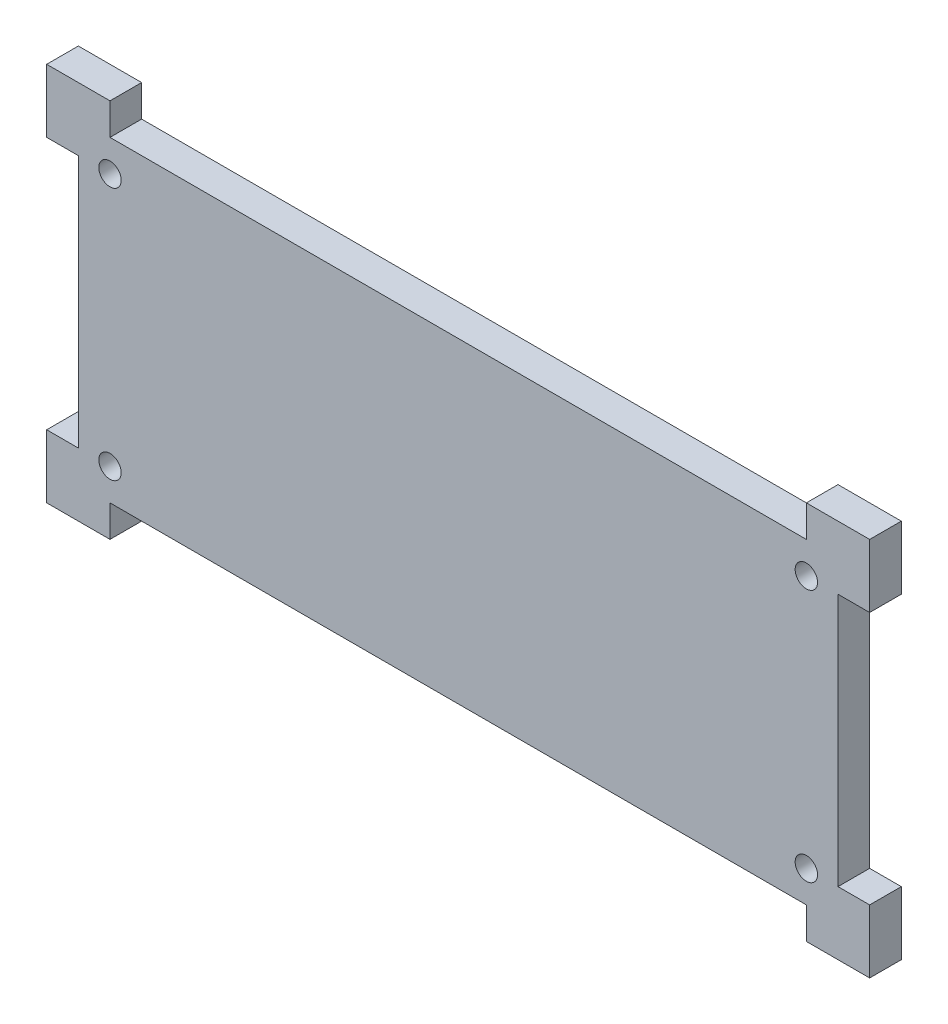
ISO-10303-21;
HEADER;
FILE_DESCRIPTION(('STEP AP214'),'2;1');
FILE_NAME('part.step','',(''),(''),'','','');
FILE_SCHEMA(('AUTOMOTIVE_DESIGN { 1 0 10303 214 1 1 1 1 }'));
ENDSEC;
DATA;
#1=APPLICATION_CONTEXT('core data for automotive mechanical design processes');
#2=APPLICATION_PROTOCOL_DEFINITION('international standard','automotive_design',2000,#1);
#3=PRODUCT_CONTEXT('',#1,'mechanical');
#4=PRODUCT('Part','Part','',(#3));
#5=PRODUCT_RELATED_PRODUCT_CATEGORY('part','',(#4));
#6=PRODUCT_DEFINITION_FORMATION('','',#4);
#7=PRODUCT_DEFINITION_CONTEXT('part definition',#1,'design');
#8=PRODUCT_DEFINITION('design','',#6,#7);
#9=PRODUCT_DEFINITION_SHAPE('','',#8);
#10=(LENGTH_UNIT() NAMED_UNIT(*) SI_UNIT(.MILLI.,.METRE.));
#11=(NAMED_UNIT(*) PLANE_ANGLE_UNIT() SI_UNIT($,.RADIAN.));
#12=(NAMED_UNIT(*) SI_UNIT($,.STERADIAN.) SOLID_ANGLE_UNIT());
#13=UNCERTAINTY_MEASURE_WITH_UNIT(LENGTH_MEASURE(1.E-05),#10,'distance_accuracy_value','');
#14=(GEOMETRIC_REPRESENTATION_CONTEXT(3) GLOBAL_UNCERTAINTY_ASSIGNED_CONTEXT((#13)) GLOBAL_UNIT_ASSIGNED_CONTEXT((#10,
#11,#12)) REPRESENTATION_CONTEXT('',''));
#15=CARTESIAN_POINT('',(0.,0.,0.));
#16=DIRECTION('',(0.,0.,1.));
#17=DIRECTION('',(1.,0.,0.));
#18=AXIS2_PLACEMENT_3D('',#15,#16,#17);
#19=CARTESIAN_POINT('',(-95.2499999999999,-6.34999999999999,188.18632750361));
#20=DIRECTION('',(0.,1.,0.));
#21=DIRECTION('',(0.,0.,1.));
#22=AXIS2_PLACEMENT_3D('',#19,#20,#21);
#23=PLANE('',#22);
#24=DIRECTION('',(1.,0.,0.));
#25=VECTOR('',#24,1.);
#26=CARTESIAN_POINT('',(-95.2499999999999,-6.34999999999999,6.34999999999999));
#27=LINE('',#26,#25);
#28=CARTESIAN_POINT('',(-107.95,-6.34999999999999,6.34999999999999));
#29=VERTEX_POINT('',#28);
#30=CARTESIAN_POINT('',(-95.2499999999999,-6.34999999999999,6.34999999999999));
#31=VERTEX_POINT('',#30);
#32=EDGE_CURVE('E242',#29,#31,#27,.T.);
#33=ORIENTED_EDGE('',*,*,#32,.F.);
#34=DIRECTION('',(0.,0.,-1.));
#35=VECTOR('',#34,1.);
#36=CARTESIAN_POINT('',(-107.95,-6.34999999999999,188.18632750361));
#37=LINE('',#36,#35);
#38=CARTESIAN_POINT('',(-107.95,-6.34999999999999,0.));
#39=VERTEX_POINT('',#38);
#40=EDGE_CURVE('E39',#29,#39,#37,.T.);
#41=ORIENTED_EDGE('',*,*,#40,.T.);
#42=DIRECTION('',(1.,0.,0.));
#43=VECTOR('',#42,1.);
#44=CARTESIAN_POINT('',(-95.2499999999999,-6.34999999999999,0.));
#45=LINE('',#44,#43);
#46=CARTESIAN_POINT('',(-95.2499999999999,-6.34999999999999,0.));
#47=VERTEX_POINT('',#46);
#48=EDGE_CURVE('E250',#39,#47,#45,.T.);
#49=ORIENTED_EDGE('',*,*,#48,.T.);
#50=DIRECTION('',(0.,0.,-1.));
#51=VECTOR('',#50,1.);
#52=CARTESIAN_POINT('',(-95.2499999999999,-6.34999999999999,188.18632750361));
#53=LINE('',#52,#51);
#54=EDGE_CURVE('E138',#31,#47,#53,.T.);
#55=ORIENTED_EDGE('',*,*,#54,.F.);
#56=EDGE_LOOP('',(#33,#41,#49,#55));
#57=FACE_BOUND('',#56,.T.);
#58=ADVANCED_FACE('F35',(#57),#23,.F.);
#59=CARTESIAN_POINT('',(-95.2499999999999,0.,188.18632750361));
#60=DIRECTION('',(-1.,0.,0.));
#61=DIRECTION('',(0.,0.,1.));
#62=AXIS2_PLACEMENT_3D('',#59,#60,#61);
#63=PLANE('',#62);
#64=DIRECTION('',(0.,1.,0.));
#65=VECTOR('',#64,1.);
#66=CARTESIAN_POINT('',(-95.2499999999999,0.,6.34999999999999));
#67=LINE('',#66,#65);
#68=CARTESIAN_POINT('',(-95.2499999999999,0.,6.34999999999999));
#69=VERTEX_POINT('',#68);
#70=EDGE_CURVE('E145',#31,#69,#67,.T.);
#71=ORIENTED_EDGE('',*,*,#70,.F.);
#72=ORIENTED_EDGE('',*,*,#54,.T.);
#73=DIRECTION('',(0.,1.,0.));
#74=VECTOR('',#73,1.);
#75=CARTESIAN_POINT('',(-95.2499999999999,0.,0.));
#76=LINE('',#75,#74);
#77=CARTESIAN_POINT('',(-95.2499999999999,0.,0.));
#78=VERTEX_POINT('',#77);
#79=EDGE_CURVE('E249',#47,#78,#76,.T.);
#80=ORIENTED_EDGE('',*,*,#79,.T.);
#81=DIRECTION('',(0.,0.,-1.));
#82=VECTOR('',#81,1.);
#83=CARTESIAN_POINT('',(-95.2499999999999,0.,188.18632750361));
#84=LINE('',#83,#82);
#85=EDGE_CURVE('E251',#69,#78,#84,.T.);
#86=ORIENTED_EDGE('',*,*,#85,.F.);
#87=EDGE_LOOP('',(#71,#72,#80,#86));
#88=FACE_BOUND('',#87,.T.);
#89=ADVANCED_FACE('F394',(#88),#63,.F.);
#90=CARTESIAN_POINT('',(44.45,0.,188.18632750361));
#91=DIRECTION('',(0.,1.,0.));
#92=DIRECTION('',(0.,0.,1.));
#93=AXIS2_PLACEMENT_3D('',#90,#91,#92);
#94=PLANE('',#93);
#95=DIRECTION('',(1.,0.,0.));
#96=VECTOR('',#95,1.);
#97=CARTESIAN_POINT('',(44.45,0.,6.34999999999999));
#98=LINE('',#97,#96);
#99=CARTESIAN_POINT('',(44.45,0.,6.34999999999999));
#100=VERTEX_POINT('',#99);
#101=EDGE_CURVE('E238',#69,#100,#98,.T.);
#102=ORIENTED_EDGE('',*,*,#101,.F.);
#103=ORIENTED_EDGE('',*,*,#85,.T.);
#104=DIRECTION('',(1.,0.,0.));
#105=VECTOR('',#104,1.);
#106=CARTESIAN_POINT('',(44.45,0.,0.));
#107=LINE('',#106,#105);
#108=CARTESIAN_POINT('',(44.45,0.,0.));
#109=VERTEX_POINT('',#108);
#110=EDGE_CURVE('E253',#78,#109,#107,.T.);
#111=ORIENTED_EDGE('',*,*,#110,.T.);
#112=DIRECTION('',(0.,0.,-1.));
#113=VECTOR('',#112,1.);
#114=CARTESIAN_POINT('',(44.45,0.,188.18632750361));
#115=LINE('',#114,#113);
#116=EDGE_CURVE('E254',#100,#109,#115,.T.);
#117=ORIENTED_EDGE('',*,*,#116,.F.);
#118=EDGE_LOOP('',(#102,#103,#111,#117));
#119=FACE_BOUND('',#118,.T.);
#120=ADVANCED_FACE('F398',(#119),#94,.F.);
#121=CARTESIAN_POINT('',(44.45,-6.34999999999999,188.18632750361));
#122=DIRECTION('',(1.,0.,0.));
#123=DIRECTION('',(0.,0.,-1.));
#124=AXIS2_PLACEMENT_3D('',#121,#122,#123);
#125=PLANE('',#124);
#126=DIRECTION('',(0.,-1.,0.));
#127=VECTOR('',#126,1.);
#128=CARTESIAN_POINT('',(44.45,-6.34999999999999,6.34999999999999));
#129=LINE('',#128,#127);
#130=CARTESIAN_POINT('',(44.45,-6.34999999999999,6.34999999999999));
#131=VERTEX_POINT('',#130);
#132=EDGE_CURVE('E235',#100,#131,#129,.T.);
#133=ORIENTED_EDGE('',*,*,#132,.F.);
#134=ORIENTED_EDGE('',*,*,#116,.T.);
#135=DIRECTION('',(0.,-1.,0.));
#136=VECTOR('',#135,1.);
#137=CARTESIAN_POINT('',(44.45,-6.34999999999999,0.));
#138=LINE('',#137,#136);
#139=CARTESIAN_POINT('',(44.45,-6.34999999999999,0.));
#140=VERTEX_POINT('',#139);
#141=EDGE_CURVE('E256',#109,#140,#138,.T.);
#142=ORIENTED_EDGE('',*,*,#141,.T.);
#143=DIRECTION('',(0.,0.,-1.));
#144=VECTOR('',#143,1.);
#145=CARTESIAN_POINT('',(44.45,-6.34999999999999,188.18632750361));
#146=LINE('',#145,#144);
#147=EDGE_CURVE('E257',#131,#140,#146,.T.);
#148=ORIENTED_EDGE('',*,*,#147,.F.);
#149=EDGE_LOOP('',(#133,#134,#142,#148));
#150=FACE_BOUND('',#149,.T.);
#151=ADVANCED_FACE('F403',(#150),#125,.F.);
#152=CARTESIAN_POINT('',(57.15,-6.34999999999999,188.18632750361));
#153=DIRECTION('',(0.,1.,0.));
#154=DIRECTION('',(0.,0.,1.));
#155=AXIS2_PLACEMENT_3D('',#152,#153,#154);
#156=PLANE('',#155);
#157=DIRECTION('',(1.,0.,0.));
#158=VECTOR('',#157,1.);
#159=CARTESIAN_POINT('',(57.15,-6.34999999999999,6.34999999999999));
#160=LINE('',#159,#158);
#161=CARTESIAN_POINT('',(57.15,-6.34999999999999,6.34999999999999));
#162=VERTEX_POINT('',#161);
#163=EDGE_CURVE('E232',#131,#162,#160,.T.);
#164=ORIENTED_EDGE('',*,*,#163,.F.);
#165=ORIENTED_EDGE('',*,*,#147,.T.);
#166=DIRECTION('',(1.,0.,0.));
#167=VECTOR('',#166,1.);
#168=CARTESIAN_POINT('',(57.15,-6.34999999999999,0.));
#169=LINE('',#168,#167);
#170=CARTESIAN_POINT('',(57.15,-6.34999999999999,0.));
#171=VERTEX_POINT('',#170);
#172=EDGE_CURVE('E259',#140,#171,#169,.T.);
#173=ORIENTED_EDGE('',*,*,#172,.T.);
#174=DIRECTION('',(0.,0.,-1.));
#175=VECTOR('',#174,1.);
#176=CARTESIAN_POINT('',(57.15,-6.34999999999999,188.18632750361));
#177=LINE('',#176,#175);
#178=EDGE_CURVE('E260',#162,#171,#177,.T.);
#179=ORIENTED_EDGE('',*,*,#178,.F.);
#180=EDGE_LOOP('',(#164,#165,#173,#179));
#181=FACE_BOUND('',#180,.T.);
#182=ADVANCED_FACE('F407',(#181),#156,.F.);
#183=CARTESIAN_POINT('',(57.15,6.35,188.18632750361));
#184=DIRECTION('',(-1.,0.,0.));
#185=DIRECTION('',(0.,-1.,0.));
#186=AXIS2_PLACEMENT_3D('',#183,#184,#185);
#187=PLANE('',#186);
#188=DIRECTION('',(0.,1.,0.));
#189=VECTOR('',#188,1.);
#190=CARTESIAN_POINT('',(57.15,6.35,6.34999999999999));
#191=LINE('',#190,#189);
#192=CARTESIAN_POINT('',(57.15,6.35,6.34999999999999));
#193=VERTEX_POINT('',#192);
#194=EDGE_CURVE('E229',#162,#193,#191,.T.);
#195=ORIENTED_EDGE('',*,*,#194,.F.);
#196=ORIENTED_EDGE('',*,*,#178,.T.);
#197=DIRECTION('',(0.,1.,0.));
#198=VECTOR('',#197,1.);
#199=CARTESIAN_POINT('',(57.15,6.35,0.));
#200=LINE('',#199,#198);
#201=CARTESIAN_POINT('',(57.15,6.35,0.));
#202=VERTEX_POINT('',#201);
#203=EDGE_CURVE('E262',#171,#202,#200,.T.);
#204=ORIENTED_EDGE('',*,*,#203,.T.);
#205=DIRECTION('',(0.,0.,-1.));
#206=VECTOR('',#205,1.);
#207=CARTESIAN_POINT('',(57.15,6.35,188.18632750361));
#208=LINE('',#207,#206);
#209=EDGE_CURVE('E263',#193,#202,#208,.T.);
#210=ORIENTED_EDGE('',*,*,#209,.F.);
#211=EDGE_LOOP('',(#195,#196,#204,#210));
#212=FACE_BOUND('',#211,.T.);
#213=ADVANCED_FACE('F411',(#212),#187,.F.);
#214=CARTESIAN_POINT('',(50.8,6.35,188.18632750361));
#215=DIRECTION('',(0.,-1.,0.));
#216=DIRECTION('',(0.,0.,-1.));
#217=AXIS2_PLACEMENT_3D('',#214,#215,#216);
#218=PLANE('',#217);
#219=DIRECTION('',(-1.,0.,0.));
#220=VECTOR('',#219,1.);
#221=CARTESIAN_POINT('',(50.8,6.35,6.34999999999999));
#222=LINE('',#221,#220);
#223=CARTESIAN_POINT('',(50.8,6.35,6.34999999999999));
#224=VERTEX_POINT('',#223);
#225=EDGE_CURVE('E226',#193,#224,#222,.T.);
#226=ORIENTED_EDGE('',*,*,#225,.F.);
#227=ORIENTED_EDGE('',*,*,#209,.T.);
#228=DIRECTION('',(-1.,0.,0.));
#229=VECTOR('',#228,1.);
#230=CARTESIAN_POINT('',(50.8,6.35,0.));
#231=LINE('',#230,#229);
#232=CARTESIAN_POINT('',(50.8,6.35,0.));
#233=VERTEX_POINT('',#232);
#234=EDGE_CURVE('E265',#202,#233,#231,.T.);
#235=ORIENTED_EDGE('',*,*,#234,.T.);
#236=DIRECTION('',(0.,0.,-1.));
#237=VECTOR('',#236,1.);
#238=CARTESIAN_POINT('',(50.8,6.35,188.18632750361));
#239=LINE('',#238,#237);
#240=EDGE_CURVE('E266',#224,#233,#239,.T.);
#241=ORIENTED_EDGE('',*,*,#240,.F.);
#242=EDGE_LOOP('',(#226,#227,#235,#241));
#243=FACE_BOUND('',#242,.T.);
#244=ADVANCED_FACE('F415',(#243),#218,.F.);
#245=CARTESIAN_POINT('',(50.8,57.15,188.18632750361));
#246=DIRECTION('',(-1.,0.,0.));
#247=DIRECTION('',(0.,0.,1.));
#248=AXIS2_PLACEMENT_3D('',#245,#246,#247);
#249=PLANE('',#248);
#250=DIRECTION('',(0.,1.,0.));
#251=VECTOR('',#250,1.);
#252=CARTESIAN_POINT('',(50.8,57.15,6.34999999999999));
#253=LINE('',#252,#251);
#254=CARTESIAN_POINT('',(50.8,57.15,6.34999999999999));
#255=VERTEX_POINT('',#254);
#256=EDGE_CURVE('E223',#224,#255,#253,.T.);
#257=ORIENTED_EDGE('',*,*,#256,.F.);
#258=ORIENTED_EDGE('',*,*,#240,.T.);
#259=DIRECTION('',(0.,1.,0.));
#260=VECTOR('',#259,1.);
#261=CARTESIAN_POINT('',(50.8,57.15,0.));
#262=LINE('',#261,#260);
#263=CARTESIAN_POINT('',(50.8,57.15,0.));
#264=VERTEX_POINT('',#263);
#265=EDGE_CURVE('E268',#233,#264,#262,.T.);
#266=ORIENTED_EDGE('',*,*,#265,.T.);
#267=DIRECTION('',(0.,0.,-1.));
#268=VECTOR('',#267,1.);
#269=CARTESIAN_POINT('',(50.8,57.15,188.18632750361));
#270=LINE('',#269,#268);
#271=EDGE_CURVE('E269',#255,#264,#270,.T.);
#272=ORIENTED_EDGE('',*,*,#271,.F.);
#273=EDGE_LOOP('',(#257,#258,#266,#272));
#274=FACE_BOUND('',#273,.T.);
#275=ADVANCED_FACE('F419',(#274),#249,.F.);
#276=CARTESIAN_POINT('',(57.15,57.15,188.18632750361));
#277=DIRECTION('',(0.,1.,0.));
#278=DIRECTION('',(0.,0.,1.));
#279=AXIS2_PLACEMENT_3D('',#276,#277,#278);
#280=PLANE('',#279);
#281=DIRECTION('',(1.,0.,0.));
#282=VECTOR('',#281,1.);
#283=CARTESIAN_POINT('',(57.15,57.15,6.34999999999999));
#284=LINE('',#283,#282);
#285=CARTESIAN_POINT('',(57.15,57.15,6.34999999999999));
#286=VERTEX_POINT('',#285);
#287=EDGE_CURVE('E220',#255,#286,#284,.T.);
#288=ORIENTED_EDGE('',*,*,#287,.F.);
#289=ORIENTED_EDGE('',*,*,#271,.T.);
#290=DIRECTION('',(1.,0.,0.));
#291=VECTOR('',#290,1.);
#292=CARTESIAN_POINT('',(57.15,57.15,0.));
#293=LINE('',#292,#291);
#294=CARTESIAN_POINT('',(57.15,57.15,0.));
#295=VERTEX_POINT('',#294);
#296=EDGE_CURVE('E271',#264,#295,#293,.T.);
#297=ORIENTED_EDGE('',*,*,#296,.T.);
#298=DIRECTION('',(0.,0.,-1.));
#299=VECTOR('',#298,1.);
#300=CARTESIAN_POINT('',(57.15,57.15,188.18632750361));
#301=LINE('',#300,#299);
#302=EDGE_CURVE('E272',#286,#295,#301,.T.);
#303=ORIENTED_EDGE('',*,*,#302,.F.);
#304=EDGE_LOOP('',(#288,#289,#297,#303));
#305=FACE_BOUND('',#304,.T.);
#306=ADVANCED_FACE('F423',(#305),#280,.F.);
#307=CARTESIAN_POINT('',(57.15,69.85,188.18632750361));
#308=DIRECTION('',(-1.,0.,0.));
#309=DIRECTION('',(0.,-1.,0.));
#310=AXIS2_PLACEMENT_3D('',#307,#308,#309);
#311=PLANE('',#310);
#312=DIRECTION('',(0.,1.,0.));
#313=VECTOR('',#312,1.);
#314=CARTESIAN_POINT('',(57.15,69.85,6.34999999999999));
#315=LINE('',#314,#313);
#316=CARTESIAN_POINT('',(57.15,69.85,6.34999999999999));
#317=VERTEX_POINT('',#316);
#318=EDGE_CURVE('E217',#286,#317,#315,.T.);
#319=ORIENTED_EDGE('',*,*,#318,.F.);
#320=ORIENTED_EDGE('',*,*,#302,.T.);
#321=DIRECTION('',(0.,1.,0.));
#322=VECTOR('',#321,1.);
#323=CARTESIAN_POINT('',(57.15,69.85,0.));
#324=LINE('',#323,#322);
#325=CARTESIAN_POINT('',(57.15,69.85,0.));
#326=VERTEX_POINT('',#325);
#327=EDGE_CURVE('E274',#295,#326,#324,.T.);
#328=ORIENTED_EDGE('',*,*,#327,.T.);
#329=DIRECTION('',(0.,0.,-1.));
#330=VECTOR('',#329,1.);
#331=CARTESIAN_POINT('',(57.15,69.85,188.18632750361));
#332=LINE('',#331,#330);
#333=EDGE_CURVE('E275',#317,#326,#332,.T.);
#334=ORIENTED_EDGE('',*,*,#333,.F.);
#335=EDGE_LOOP('',(#319,#320,#328,#334));
#336=FACE_BOUND('',#335,.T.);
#337=ADVANCED_FACE('F427',(#336),#311,.F.);
#338=CARTESIAN_POINT('',(44.45,69.85,188.18632750361));
#339=DIRECTION('',(0.,-1.,0.));
#340=DIRECTION('',(0.,0.,-1.));
#341=AXIS2_PLACEMENT_3D('',#338,#339,#340);
#342=PLANE('',#341);
#343=DIRECTION('',(-1.,0.,0.));
#344=VECTOR('',#343,1.);
#345=CARTESIAN_POINT('',(44.45,69.85,6.34999999999999));
#346=LINE('',#345,#344);
#347=CARTESIAN_POINT('',(44.45,69.85,6.34999999999999));
#348=VERTEX_POINT('',#347);
#349=EDGE_CURVE('E214',#317,#348,#346,.T.);
#350=ORIENTED_EDGE('',*,*,#349,.F.);
#351=ORIENTED_EDGE('',*,*,#333,.T.);
#352=DIRECTION('',(-1.,0.,0.));
#353=VECTOR('',#352,1.);
#354=CARTESIAN_POINT('',(44.45,69.85,0.));
#355=LINE('',#354,#353);
#356=CARTESIAN_POINT('',(44.45,69.85,0.));
#357=VERTEX_POINT('',#356);
#358=EDGE_CURVE('E277',#326,#357,#355,.T.);
#359=ORIENTED_EDGE('',*,*,#358,.T.);
#360=DIRECTION('',(0.,0.,-1.));
#361=VECTOR('',#360,1.);
#362=CARTESIAN_POINT('',(44.45,69.85,188.18632750361));
#363=LINE('',#362,#361);
#364=EDGE_CURVE('E278',#348,#357,#363,.T.);
#365=ORIENTED_EDGE('',*,*,#364,.F.);
#366=EDGE_LOOP('',(#350,#351,#359,#365));
#367=FACE_BOUND('',#366,.T.);
#368=ADVANCED_FACE('F431',(#367),#342,.F.);
#369=CARTESIAN_POINT('',(44.45,63.5,188.18632750361));
#370=DIRECTION('',(1.,0.,0.));
#371=DIRECTION('',(0.,0.,-1.));
#372=AXIS2_PLACEMENT_3D('',#369,#370,#371);
#373=PLANE('',#372);
#374=DIRECTION('',(0.,-1.,0.));
#375=VECTOR('',#374,1.);
#376=CARTESIAN_POINT('',(44.45,63.5,6.34999999999999));
#377=LINE('',#376,#375);
#378=CARTESIAN_POINT('',(44.45,63.5,6.34999999999999));
#379=VERTEX_POINT('',#378);
#380=EDGE_CURVE('E211',#348,#379,#377,.T.);
#381=ORIENTED_EDGE('',*,*,#380,.F.);
#382=ORIENTED_EDGE('',*,*,#364,.T.);
#383=DIRECTION('',(0.,-1.,0.));
#384=VECTOR('',#383,1.);
#385=CARTESIAN_POINT('',(44.45,63.5,0.));
#386=LINE('',#385,#384);
#387=CARTESIAN_POINT('',(44.45,63.5,0.));
#388=VERTEX_POINT('',#387);
#389=EDGE_CURVE('E280',#357,#388,#386,.T.);
#390=ORIENTED_EDGE('',*,*,#389,.T.);
#391=DIRECTION('',(0.,0.,-1.));
#392=VECTOR('',#391,1.);
#393=CARTESIAN_POINT('',(44.45,63.5,188.18632750361));
#394=LINE('',#393,#392);
#395=EDGE_CURVE('E281',#379,#388,#394,.T.);
#396=ORIENTED_EDGE('',*,*,#395,.F.);
#397=EDGE_LOOP('',(#381,#382,#390,#396));
#398=FACE_BOUND('',#397,.T.);
#399=ADVANCED_FACE('F435',(#398),#373,.F.);
#400=CARTESIAN_POINT('',(-95.2499999999999,63.5,188.18632750361));
#401=DIRECTION('',(0.,-1.,0.));
#402=DIRECTION('',(0.,0.,-1.));
#403=AXIS2_PLACEMENT_3D('',#400,#401,#402);
#404=PLANE('',#403);
#405=DIRECTION('',(-1.,0.,0.));
#406=VECTOR('',#405,1.);
#407=CARTESIAN_POINT('',(-95.2499999999999,63.5,6.34999999999999));
#408=LINE('',#407,#406);
#409=CARTESIAN_POINT('',(-95.2499999999999,63.5,6.34999999999999));
#410=VERTEX_POINT('',#409);
#411=EDGE_CURVE('E208',#379,#410,#408,.T.);
#412=ORIENTED_EDGE('',*,*,#411,.F.);
#413=ORIENTED_EDGE('',*,*,#395,.T.);
#414=DIRECTION('',(-1.,0.,0.));
#415=VECTOR('',#414,1.);
#416=CARTESIAN_POINT('',(-95.2499999999999,63.5,0.));
#417=LINE('',#416,#415);
#418=CARTESIAN_POINT('',(-95.2499999999999,63.5,0.));
#419=VERTEX_POINT('',#418);
#420=EDGE_CURVE('E283',#388,#419,#417,.T.);
#421=ORIENTED_EDGE('',*,*,#420,.T.);
#422=DIRECTION('',(0.,0.,-1.));
#423=VECTOR('',#422,1.);
#424=CARTESIAN_POINT('',(-95.2499999999999,63.5,188.18632750361));
#425=LINE('',#424,#423);
#426=EDGE_CURVE('E284',#410,#419,#425,.T.);
#427=ORIENTED_EDGE('',*,*,#426,.F.);
#428=EDGE_LOOP('',(#412,#413,#421,#427));
#429=FACE_BOUND('',#428,.T.);
#430=ADVANCED_FACE('F439',(#429),#404,.F.);
#431=CARTESIAN_POINT('',(-95.2499999999999,69.85,188.18632750361));
#432=DIRECTION('',(-1.,0.,0.));
#433=DIRECTION('',(0.,0.,1.));
#434=AXIS2_PLACEMENT_3D('',#431,#432,#433);
#435=PLANE('',#434);
#436=DIRECTION('',(0.,1.,0.));
#437=VECTOR('',#436,1.);
#438=CARTESIAN_POINT('',(-95.2499999999999,69.85,6.34999999999999));
#439=LINE('',#438,#437);
#440=CARTESIAN_POINT('',(-95.2499999999999,69.85,6.34999999999999));
#441=VERTEX_POINT('',#440);
#442=EDGE_CURVE('E205',#410,#441,#439,.T.);
#443=ORIENTED_EDGE('',*,*,#442,.F.);
#444=ORIENTED_EDGE('',*,*,#426,.T.);
#445=DIRECTION('',(0.,1.,0.));
#446=VECTOR('',#445,1.);
#447=CARTESIAN_POINT('',(-95.2499999999999,69.85,0.));
#448=LINE('',#447,#446);
#449=CARTESIAN_POINT('',(-95.2499999999999,69.85,0.));
#450=VERTEX_POINT('',#449);
#451=EDGE_CURVE('E286',#419,#450,#448,.T.);
#452=ORIENTED_EDGE('',*,*,#451,.T.);
#453=DIRECTION('',(0.,0.,-1.));
#454=VECTOR('',#453,1.);
#455=CARTESIAN_POINT('',(-95.2499999999999,69.85,188.18632750361));
#456=LINE('',#455,#454);
#457=EDGE_CURVE('E287',#441,#450,#456,.T.);
#458=ORIENTED_EDGE('',*,*,#457,.F.);
#459=EDGE_LOOP('',(#443,#444,#452,#458));
#460=FACE_BOUND('',#459,.T.);
#461=ADVANCED_FACE('F443',(#460),#435,.F.);
#462=CARTESIAN_POINT('',(-107.95,69.85,188.18632750361));
#463=DIRECTION('',(0.,-1.,0.));
#464=DIRECTION('',(0.,0.,-1.));
#465=AXIS2_PLACEMENT_3D('',#462,#463,#464);
#466=PLANE('',#465);
#467=DIRECTION('',(-1.,0.,0.));
#468=VECTOR('',#467,1.);
#469=CARTESIAN_POINT('',(-107.95,69.85,6.34999999999999));
#470=LINE('',#469,#468);
#471=CARTESIAN_POINT('',(-107.95,69.85,6.34999999999999));
#472=VERTEX_POINT('',#471);
#473=EDGE_CURVE('E202',#441,#472,#470,.T.);
#474=ORIENTED_EDGE('',*,*,#473,.F.);
#475=ORIENTED_EDGE('',*,*,#457,.T.);
#476=DIRECTION('',(-1.,0.,0.));
#477=VECTOR('',#476,1.);
#478=CARTESIAN_POINT('',(-107.95,69.85,0.));
#479=LINE('',#478,#477);
#480=CARTESIAN_POINT('',(-107.95,69.85,0.));
#481=VERTEX_POINT('',#480);
#482=EDGE_CURVE('E289',#450,#481,#479,.T.);
#483=ORIENTED_EDGE('',*,*,#482,.T.);
#484=DIRECTION('',(0.,0.,-1.));
#485=VECTOR('',#484,1.);
#486=CARTESIAN_POINT('',(-107.95,69.85,188.18632750361));
#487=LINE('',#486,#485);
#488=EDGE_CURVE('E290',#472,#481,#487,.T.);
#489=ORIENTED_EDGE('',*,*,#488,.F.);
#490=EDGE_LOOP('',(#474,#475,#483,#489));
#491=FACE_BOUND('',#490,.T.);
#492=ADVANCED_FACE('F447',(#491),#466,.F.);
#493=CARTESIAN_POINT('',(-107.95,57.15,188.18632750361));
#494=DIRECTION('',(1.,0.,0.));
#495=DIRECTION('',(0.,1.,0.));
#496=AXIS2_PLACEMENT_3D('',#493,#494,#495);
#497=PLANE('',#496);
#498=DIRECTION('',(0.,-1.,0.));
#499=VECTOR('',#498,1.);
#500=CARTESIAN_POINT('',(-107.95,57.15,6.34999999999999));
#501=LINE('',#500,#499);
#502=CARTESIAN_POINT('',(-107.95,57.15,6.34999999999999));
#503=VERTEX_POINT('',#502);
#504=EDGE_CURVE('E197',#472,#503,#501,.T.);
#505=ORIENTED_EDGE('',*,*,#504,.F.);
#506=ORIENTED_EDGE('',*,*,#488,.T.);
#507=DIRECTION('',(0.,-1.,0.));
#508=VECTOR('',#507,1.);
#509=CARTESIAN_POINT('',(-107.95,57.15,0.));
#510=LINE('',#509,#508);
#511=CARTESIAN_POINT('',(-107.95,57.15,0.));
#512=VERTEX_POINT('',#511);
#513=EDGE_CURVE('E292',#481,#512,#510,.T.);
#514=ORIENTED_EDGE('',*,*,#513,.T.);
#515=DIRECTION('',(0.,0.,-1.));
#516=VECTOR('',#515,1.);
#517=CARTESIAN_POINT('',(-107.95,57.15,188.18632750361));
#518=LINE('',#517,#516);
#519=EDGE_CURVE('E293',#503,#512,#518,.T.);
#520=ORIENTED_EDGE('',*,*,#519,.F.);
#521=EDGE_LOOP('',(#505,#506,#514,#520));
#522=FACE_BOUND('',#521,.T.);
#523=ADVANCED_FACE('F451',(#522),#497,.F.);
#524=CARTESIAN_POINT('',(-101.6,57.15,188.18632750361));
#525=DIRECTION('',(0.,1.,0.));
#526=DIRECTION('',(0.,0.,1.));
#527=AXIS2_PLACEMENT_3D('',#524,#525,#526);
#528=PLANE('',#527);
#529=DIRECTION('',(1.,0.,0.));
#530=VECTOR('',#529,1.);
#531=CARTESIAN_POINT('',(-101.6,57.15,6.34999999999999));
#532=LINE('',#531,#530);
#533=CARTESIAN_POINT('',(-101.6,57.15,6.34999999999999));
#534=VERTEX_POINT('',#533);
#535=EDGE_CURVE('E195',#503,#534,#532,.T.);
#536=ORIENTED_EDGE('',*,*,#535,.F.);
#537=ORIENTED_EDGE('',*,*,#519,.T.);
#538=DIRECTION('',(1.,0.,0.));
#539=VECTOR('',#538,1.);
#540=CARTESIAN_POINT('',(-101.6,57.15,0.));
#541=LINE('',#540,#539);
#542=CARTESIAN_POINT('',(-101.6,57.15,0.));
#543=VERTEX_POINT('',#542);
#544=EDGE_CURVE('E295',#512,#543,#541,.T.);
#545=ORIENTED_EDGE('',*,*,#544,.T.);
#546=DIRECTION('',(0.,0.,-1.));
#547=VECTOR('',#546,1.);
#548=CARTESIAN_POINT('',(-101.6,57.15,188.18632750361));
#549=LINE('',#548,#547);
#550=EDGE_CURVE('E296',#534,#543,#549,.T.);
#551=ORIENTED_EDGE('',*,*,#550,.F.);
#552=EDGE_LOOP('',(#536,#537,#545,#551));
#553=FACE_BOUND('',#552,.T.);
#554=ADVANCED_FACE('F455',(#553),#528,.F.);
#555=CARTESIAN_POINT('',(-101.6,6.35000000000002,188.18632750361));
#556=DIRECTION('',(1.,0.,0.));
#557=DIRECTION('',(0.,0.,-1.));
#558=AXIS2_PLACEMENT_3D('',#555,#556,#557);
#559=PLANE('',#558);
#560=DIRECTION('',(0.,-1.,0.));
#561=VECTOR('',#560,1.);
#562=CARTESIAN_POINT('',(-101.6,6.35000000000002,6.34999999999999));
#563=LINE('',#562,#561);
#564=CARTESIAN_POINT('',(-101.6,6.35000000000002,6.34999999999999));
#565=VERTEX_POINT('',#564);
#566=EDGE_CURVE('E44',#534,#565,#563,.T.);
#567=ORIENTED_EDGE('',*,*,#566,.F.);
#568=ORIENTED_EDGE('',*,*,#550,.T.);
#569=DIRECTION('',(0.,-1.,0.));
#570=VECTOR('',#569,1.);
#571=CARTESIAN_POINT('',(-101.6,6.35000000000002,0.));
#572=LINE('',#571,#570);
#573=CARTESIAN_POINT('',(-101.6,6.35000000000002,0.));
#574=VERTEX_POINT('',#573);
#575=EDGE_CURVE('E189',#543,#574,#572,.T.);
#576=ORIENTED_EDGE('',*,*,#575,.T.);
#577=DIRECTION('',(0.,0.,-1.));
#578=VECTOR('',#577,1.);
#579=CARTESIAN_POINT('',(-101.6,6.35000000000002,188.18632750361));
#580=LINE('',#579,#578);
#581=EDGE_CURVE('E180',#565,#574,#580,.T.);
#582=ORIENTED_EDGE('',*,*,#581,.F.);
#583=EDGE_LOOP('',(#567,#568,#576,#582));
#584=FACE_BOUND('',#583,.T.);
#585=ADVANCED_FACE('F186',(#584),#559,.F.);
#586=CARTESIAN_POINT('',(-107.95,6.35000000000002,188.18632750361));
#587=DIRECTION('',(0.,-1.,0.));
#588=DIRECTION('',(0.,0.,-1.));
#589=AXIS2_PLACEMENT_3D('',#586,#587,#588);
#590=PLANE('',#589);
#591=DIRECTION('',(-1.,0.,0.));
#592=VECTOR('',#591,1.);
#593=CARTESIAN_POINT('',(-107.95,6.35000000000002,6.34999999999999));
#594=LINE('',#593,#592);
#595=CARTESIAN_POINT('',(-107.95,6.35000000000002,6.34999999999999));
#596=VERTEX_POINT('',#595);
#597=EDGE_CURVE('E11',#565,#596,#594,.T.);
#598=ORIENTED_EDGE('',*,*,#597,.F.);
#599=ORIENTED_EDGE('',*,*,#581,.T.);
#600=DIRECTION('',(-1.,0.,0.));
#601=VECTOR('',#600,1.);
#602=CARTESIAN_POINT('',(-107.95,6.35000000000002,0.));
#603=LINE('',#602,#601);
#604=CARTESIAN_POINT('',(-107.95,6.35000000000002,0.));
#605=VERTEX_POINT('',#604);
#606=EDGE_CURVE('E191',#574,#605,#603,.T.);
#607=ORIENTED_EDGE('',*,*,#606,.T.);
#608=DIRECTION('',(0.,0.,-1.));
#609=VECTOR('',#608,1.);
#610=CARTESIAN_POINT('',(-107.95,6.35000000000002,188.18632750361));
#611=LINE('',#610,#609);
#612=EDGE_CURVE('E57',#596,#605,#611,.T.);
#613=ORIENTED_EDGE('',*,*,#612,.F.);
#614=EDGE_LOOP('',(#598,#599,#607,#613));
#615=FACE_BOUND('',#614,.T.);
#616=ADVANCED_FACE('F179',(#615),#590,.F.);
#617=CARTESIAN_POINT('',(-107.95,-6.34999999999999,188.18632750361));
#618=DIRECTION('',(1.,0.,0.));
#619=DIRECTION('',(0.,0.,-1.));
#620=AXIS2_PLACEMENT_3D('',#617,#618,#619);
#621=PLANE('',#620);
#622=DIRECTION('',(0.,-1.,0.));
#623=VECTOR('',#622,1.);
#624=CARTESIAN_POINT('',(-107.95,-6.34999999999999,6.34999999999999));
#625=LINE('',#624,#623);
#626=EDGE_CURVE('E245',#596,#29,#625,.T.);
#627=ORIENTED_EDGE('',*,*,#626,.F.);
#628=ORIENTED_EDGE('',*,*,#612,.T.);
#629=DIRECTION('',(0.,-1.,0.));
#630=VECTOR('',#629,1.);
#631=CARTESIAN_POINT('',(-107.95,-6.34999999999999,0.));
#632=LINE('',#631,#630);
#633=EDGE_CURVE('E247',#605,#39,#632,.T.);
#634=ORIENTED_EDGE('',*,*,#633,.T.);
#635=ORIENTED_EDGE('',*,*,#40,.F.);
#636=EDGE_LOOP('',(#627,#628,#634,#635));
#637=FACE_BOUND('',#636,.T.);
#638=ADVANCED_FACE('F464',(#637),#621,.F.);
#639=CARTESIAN_POINT('',(0.,0.,0.));
#640=DIRECTION('',(0.,0.,-1.));
#641=DIRECTION('',(-1.,0.,0.));
#642=AXIS2_PLACEMENT_3D('',#639,#640,#641);
#643=PLANE('',#642);
#644=CARTESIAN_POINT('',(-95.2499999999999,6.35,0.));
#645=DIRECTION('',(0.,0.,1.));
#646=DIRECTION('',(1.,0.,0.));
#647=AXIS2_PLACEMENT_3D('',#644,#645,#646);
#648=CIRCLE('',#647,2.2479);
#649=CARTESIAN_POINT('',(-93.0020999999999,6.35,0.));
#650=VERTEX_POINT('',#649);
#651=EDGE_CURVE('E354',#650,#650,#648,.T.);
#652=ORIENTED_EDGE('',*,*,#651,.T.);
#653=EDGE_LOOP('',(#652));
#654=FACE_BOUND('',#653,.T.);
#655=CARTESIAN_POINT('',(-95.2499999999999,57.15,0.));
#656=DIRECTION('',(0.,0.,1.));
#657=DIRECTION('',(1.,0.,0.));
#658=AXIS2_PLACEMENT_3D('',#655,#656,#657);
#659=CIRCLE('',#658,2.2479);
#660=CARTESIAN_POINT('',(-93.0020999999999,57.15,0.));
#661=VERTEX_POINT('',#660);
#662=EDGE_CURVE('E348',#661,#661,#659,.T.);
#663=ORIENTED_EDGE('',*,*,#662,.T.);
#664=EDGE_LOOP('',(#663));
#665=FACE_BOUND('',#664,.T.);
#666=CARTESIAN_POINT('',(44.45,57.15,0.));
#667=DIRECTION('',(0.,0.,1.));
#668=DIRECTION('',(1.,0.,0.));
#669=AXIS2_PLACEMENT_3D('',#666,#667,#668);
#670=CIRCLE('',#669,2.2479);
#671=CARTESIAN_POINT('',(46.6979,57.15,0.));
#672=VERTEX_POINT('',#671);
#673=EDGE_CURVE('E343',#672,#672,#670,.T.);
#674=ORIENTED_EDGE('',*,*,#673,.T.);
#675=EDGE_LOOP('',(#674));
#676=FACE_BOUND('',#675,.T.);
#677=CARTESIAN_POINT('',(44.45,6.35,0.));
#678=DIRECTION('',(0.,0.,1.));
#679=DIRECTION('',(1.,0.,0.));
#680=AXIS2_PLACEMENT_3D('',#677,#678,#679);
#681=CIRCLE('',#680,2.2479);
#682=CARTESIAN_POINT('',(46.6979,6.35,0.));
#683=VERTEX_POINT('',#682);
#684=EDGE_CURVE('E336',#683,#683,#681,.T.);
#685=ORIENTED_EDGE('',*,*,#684,.T.);
#686=EDGE_LOOP('',(#685));
#687=FACE_BOUND('',#686,.T.);
#688=ORIENTED_EDGE('',*,*,#48,.F.);
#689=ORIENTED_EDGE('',*,*,#633,.F.);
#690=ORIENTED_EDGE('',*,*,#606,.F.);
#691=ORIENTED_EDGE('',*,*,#575,.F.);
#692=ORIENTED_EDGE('',*,*,#544,.F.);
#693=ORIENTED_EDGE('',*,*,#513,.F.);
#694=ORIENTED_EDGE('',*,*,#482,.F.);
#695=ORIENTED_EDGE('',*,*,#451,.F.);
#696=ORIENTED_EDGE('',*,*,#420,.F.);
#697=ORIENTED_EDGE('',*,*,#389,.F.);
#698=ORIENTED_EDGE('',*,*,#358,.F.);
#699=ORIENTED_EDGE('',*,*,#327,.F.);
#700=ORIENTED_EDGE('',*,*,#296,.F.);
#701=ORIENTED_EDGE('',*,*,#265,.F.);
#702=ORIENTED_EDGE('',*,*,#234,.F.);
#703=ORIENTED_EDGE('',*,*,#203,.F.);
#704=ORIENTED_EDGE('',*,*,#172,.F.);
#705=ORIENTED_EDGE('',*,*,#141,.F.);
#706=ORIENTED_EDGE('',*,*,#110,.F.);
#707=ORIENTED_EDGE('',*,*,#79,.F.);
#708=EDGE_LOOP('',(#688,#689,#690,#691,#692,#693,#694,#695,#696,#697,#698,#699,#700,#701,#702,
#703,#704,#705,#706,#707));
#709=FACE_BOUND('',#708,.T.);
#710=ADVANCED_FACE('F363',(#654,#665,#676,#687,#709),#643,.T.);
#711=CARTESIAN_POINT('',(-95.2499999999999,-118.33632750361,6.34999999999999));
#712=DIRECTION('',(0.,0.,1.));
#713=DIRECTION('',(0.,1.,0.));
#714=AXIS2_PLACEMENT_3D('',#711,#712,#713);
#715=PLANE('',#714);
#716=CARTESIAN_POINT('',(-95.2499999999999,6.35,6.34999999999999));
#717=DIRECTION('',(0.,0.,1.));
#718=DIRECTION('',(1.,0.,0.));
#719=AXIS2_PLACEMENT_3D('',#716,#717,#718);
#720=CIRCLE('',#719,2.2479);
#721=CARTESIAN_POINT('',(-93.0020999999999,6.35,6.34999999999999));
#722=VERTEX_POINT('',#721);
#723=EDGE_CURVE('E357',#722,#722,#720,.T.);
#724=ORIENTED_EDGE('',*,*,#723,.F.);
#725=EDGE_LOOP('',(#724));
#726=FACE_BOUND('',#725,.T.);
#727=CARTESIAN_POINT('',(-95.2499999999999,57.15,6.34999999999999));
#728=DIRECTION('',(0.,0.,1.));
#729=DIRECTION('',(1.,0.,0.));
#730=AXIS2_PLACEMENT_3D('',#727,#728,#729);
#731=CIRCLE('',#730,2.2479);
#732=CARTESIAN_POINT('',(-93.0020999999999,57.15,6.34999999999999));
#733=VERTEX_POINT('',#732);
#734=EDGE_CURVE('E351',#733,#733,#731,.T.);
#735=ORIENTED_EDGE('',*,*,#734,.F.);
#736=EDGE_LOOP('',(#735));
#737=FACE_BOUND('',#736,.T.);
#738=CARTESIAN_POINT('',(44.45,57.15,6.34999999999999));
#739=DIRECTION('',(0.,0.,1.));
#740=DIRECTION('',(1.,0.,0.));
#741=AXIS2_PLACEMENT_3D('',#738,#739,#740);
#742=CIRCLE('',#741,2.2479);
#743=CARTESIAN_POINT('',(46.6979,57.15,6.34999999999999));
#744=VERTEX_POINT('',#743);
#745=EDGE_CURVE('E345',#744,#744,#742,.T.);
#746=ORIENTED_EDGE('',*,*,#745,.F.);
#747=EDGE_LOOP('',(#746));
#748=FACE_BOUND('',#747,.T.);
#749=CARTESIAN_POINT('',(44.45,6.35,6.34999999999999));
#750=DIRECTION('',(0.,0.,1.));
#751=DIRECTION('',(1.,0.,0.));
#752=AXIS2_PLACEMENT_3D('',#749,#750,#751);
#753=CIRCLE('',#752,2.2479);
#754=CARTESIAN_POINT('',(46.6979,6.35,6.34999999999999));
#755=VERTEX_POINT('',#754);
#756=EDGE_CURVE('E338',#755,#755,#753,.T.);
#757=ORIENTED_EDGE('',*,*,#756,.F.);
#758=EDGE_LOOP('',(#757));
#759=FACE_BOUND('',#758,.T.);
#760=ORIENTED_EDGE('',*,*,#626,.T.);
#761=ORIENTED_EDGE('',*,*,#32,.T.);
#762=ORIENTED_EDGE('',*,*,#70,.T.);
#763=ORIENTED_EDGE('',*,*,#101,.T.);
#764=ORIENTED_EDGE('',*,*,#132,.T.);
#765=ORIENTED_EDGE('',*,*,#163,.T.);
#766=ORIENTED_EDGE('',*,*,#194,.T.);
#767=ORIENTED_EDGE('',*,*,#225,.T.);
#768=ORIENTED_EDGE('',*,*,#256,.T.);
#769=ORIENTED_EDGE('',*,*,#287,.T.);
#770=ORIENTED_EDGE('',*,*,#318,.T.);
#771=ORIENTED_EDGE('',*,*,#349,.T.);
#772=ORIENTED_EDGE('',*,*,#380,.T.);
#773=ORIENTED_EDGE('',*,*,#411,.T.);
#774=ORIENTED_EDGE('',*,*,#442,.T.);
#775=ORIENTED_EDGE('',*,*,#473,.T.);
#776=ORIENTED_EDGE('',*,*,#504,.T.);
#777=ORIENTED_EDGE('',*,*,#535,.T.);
#778=ORIENTED_EDGE('',*,*,#566,.T.);
#779=ORIENTED_EDGE('',*,*,#597,.T.);
#780=EDGE_LOOP('',(#760,#761,#762,#763,#764,#765,#766,#767,#768,#769,#770,#771,#772,#773,#774,
#775,#776,#777,#778,#779));
#781=FACE_BOUND('',#780,.T.);
#782=ADVANCED_FACE('F37',(#726,#737,#748,#759,#781),#715,.T.);
#783=CARTESIAN_POINT('',(44.45,6.35,0.));
#784=DIRECTION('',(0.,0.,1.));
#785=DIRECTION('',(1.,0.,0.));
#786=AXIS2_PLACEMENT_3D('',#783,#784,#785);
#787=CYLINDRICAL_SURFACE('',#786,2.2479);
#788=ORIENTED_EDGE('',*,*,#684,.F.);
#789=EDGE_LOOP('',(#788));
#790=FACE_BOUND('',#789,.T.);
#791=ORIENTED_EDGE('',*,*,#756,.T.);
#792=EDGE_LOOP('',(#791));
#793=FACE_BOUND('',#792,.T.);
#794=ADVANCED_FACE('F375',(#790,#793),#787,.F.);
#795=CARTESIAN_POINT('',(44.45,57.15,0.));
#796=DIRECTION('',(0.,0.,1.));
#797=DIRECTION('',(1.,0.,0.));
#798=AXIS2_PLACEMENT_3D('',#795,#796,#797);
#799=CYLINDRICAL_SURFACE('',#798,2.2479);
#800=ORIENTED_EDGE('',*,*,#673,.F.);
#801=EDGE_LOOP('',(#800));
#802=FACE_BOUND('',#801,.T.);
#803=ORIENTED_EDGE('',*,*,#745,.T.);
#804=EDGE_LOOP('',(#803));
#805=FACE_BOUND('',#804,.T.);
#806=ADVANCED_FACE('F383',(#802,#805),#799,.F.);
#807=CARTESIAN_POINT('',(-95.2499999999999,57.15,0.));
#808=DIRECTION('',(0.,0.,1.));
#809=DIRECTION('',(1.,0.,0.));
#810=AXIS2_PLACEMENT_3D('',#807,#808,#809);
#811=CYLINDRICAL_SURFACE('',#810,2.2479);
#812=ORIENTED_EDGE('',*,*,#662,.F.);
#813=EDGE_LOOP('',(#812));
#814=FACE_BOUND('',#813,.T.);
#815=ORIENTED_EDGE('',*,*,#734,.T.);
#816=EDGE_LOOP('',(#815));
#817=FACE_BOUND('',#816,.T.);
#818=ADVANCED_FACE('F369',(#814,#817),#811,.F.);
#819=CARTESIAN_POINT('',(-95.2499999999999,6.35,0.));
#820=DIRECTION('',(0.,0.,1.));
#821=DIRECTION('',(1.,0.,0.));
#822=AXIS2_PLACEMENT_3D('',#819,#820,#821);
#823=CYLINDRICAL_SURFACE('',#822,2.2479);
#824=ORIENTED_EDGE('',*,*,#651,.F.);
#825=EDGE_LOOP('',(#824));
#826=FACE_BOUND('',#825,.T.);
#827=ORIENTED_EDGE('',*,*,#723,.T.);
#828=EDGE_LOOP('',(#827));
#829=FACE_BOUND('',#828,.T.);
#830=ADVANCED_FACE('F366',(#826,#829),#823,.F.);
#831=CLOSED_SHELL('',(#58,#89,#120,#151,#182,#213,#244,#275,#306,#337,#368,#399,#430,#461,#492,
#523,#554,#585,#616,#638,#710,#782,#794,#806,#818,#830));
#832=MANIFOLD_SOLID_BREP('B2',#831);
#833=ADVANCED_BREP_SHAPE_REPRESENTATION('',(#18,#832),#14);
#834=SHAPE_DEFINITION_REPRESENTATION(#9,#833);
ENDSEC;
END-ISO-10303-21;
